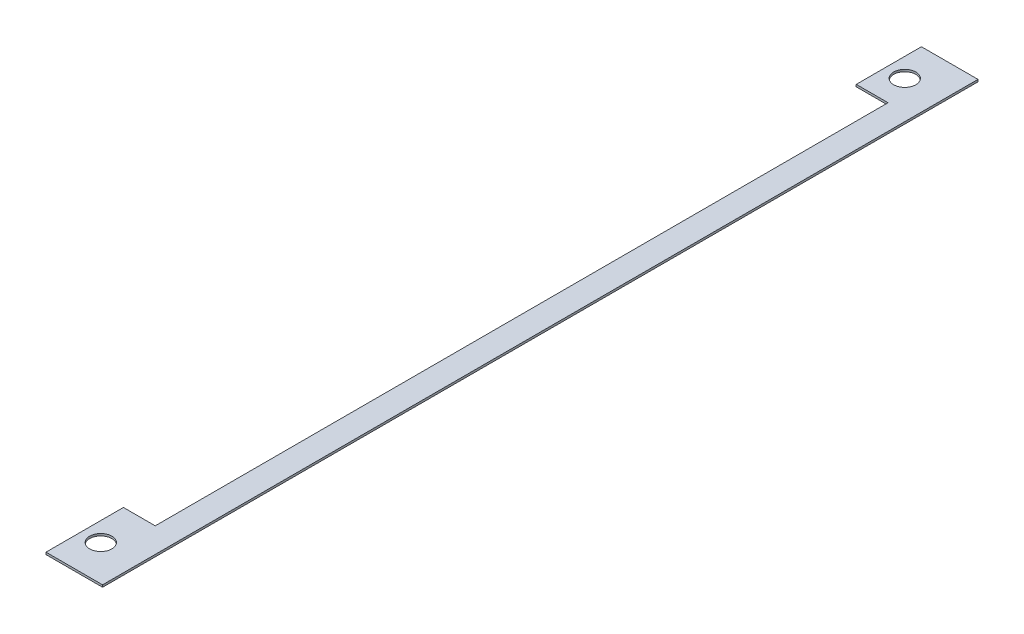
ISO-10303-21;
HEADER;
FILE_DESCRIPTION(('STEP AP214'),'2;1');
FILE_NAME('part.step','',(''),(''),'','','');
FILE_SCHEMA(('AUTOMOTIVE_DESIGN { 1 0 10303 214 1 1 1 1 }'));
ENDSEC;
DATA;
#1=APPLICATION_CONTEXT('core data for automotive mechanical design processes');
#2=APPLICATION_PROTOCOL_DEFINITION('international standard','automotive_design',2000,#1);
#3=PRODUCT_CONTEXT('',#1,'mechanical');
#4=PRODUCT('Part','Part','',(#3));
#5=PRODUCT_RELATED_PRODUCT_CATEGORY('part','',(#4));
#6=PRODUCT_DEFINITION_FORMATION('','',#4);
#7=PRODUCT_DEFINITION_CONTEXT('part definition',#1,'design');
#8=PRODUCT_DEFINITION('design','',#6,#7);
#9=PRODUCT_DEFINITION_SHAPE('','',#8);
#10=(LENGTH_UNIT() NAMED_UNIT(*) SI_UNIT(.MILLI.,.METRE.));
#11=(NAMED_UNIT(*) PLANE_ANGLE_UNIT() SI_UNIT($,.RADIAN.));
#12=(NAMED_UNIT(*) SI_UNIT($,.STERADIAN.) SOLID_ANGLE_UNIT());
#13=UNCERTAINTY_MEASURE_WITH_UNIT(LENGTH_MEASURE(1.E-05),#10,'distance_accuracy_value','');
#14=(GEOMETRIC_REPRESENTATION_CONTEXT(3) GLOBAL_UNCERTAINTY_ASSIGNED_CONTEXT((#13)) GLOBAL_UNIT_ASSIGNED_CONTEXT((#10,
#11,#12)) REPRESENTATION_CONTEXT('',''));
#15=CARTESIAN_POINT('',(0.,0.,0.));
#16=DIRECTION('',(0.,0.,1.));
#17=DIRECTION('',(1.,0.,0.));
#18=AXIS2_PLACEMENT_3D('',#15,#16,#17);
#19=CARTESIAN_POINT('',(0.,-15.4,-135.4));
#20=DIRECTION('',(0.,0.,1.));
#21=DIRECTION('',(1.,0.,0.));
#22=AXIS2_PLACEMENT_3D('',#19,#20,#21);
#23=PLANE('',#22);
#24=DIRECTION('',(1.,0.,0.));
#25=VECTOR('',#24,1.);
#26=CARTESIAN_POINT('',(0.,-15.4,-135.4));
#27=LINE('',#26,#25);
#28=CARTESIAN_POINT('',(194.168067580839,-15.4,-135.4));
#29=VERTEX_POINT('',#28);
#30=CARTESIAN_POINT('',(210.,-15.4,-135.4));
#31=VERTEX_POINT('',#30);
#32=EDGE_CURVE('E138',#29,#31,#27,.T.);
#33=ORIENTED_EDGE('',*,*,#32,.F.);
#34=DIRECTION('',(0.,1.,0.));
#35=VECTOR('',#34,1.);
#36=CARTESIAN_POINT('',(194.168067580839,-15.4,-135.4));
#37=LINE('',#36,#35);
#38=CARTESIAN_POINT('',(194.168067580839,-14.8,-135.4));
#39=VERTEX_POINT('',#38);
#40=EDGE_CURVE('E125',#29,#39,#37,.T.);
#41=ORIENTED_EDGE('',*,*,#40,.T.);
#42=DIRECTION('',(1.,0.,0.));
#43=VECTOR('',#42,1.);
#44=CARTESIAN_POINT('',(-36.,-14.8,-135.4));
#45=LINE('',#44,#43);
#46=CARTESIAN_POINT('',(210.,-14.8,-135.4));
#47=VERTEX_POINT('',#46);
#48=EDGE_CURVE('E153',#39,#47,#45,.T.);
#49=ORIENTED_EDGE('',*,*,#48,.T.);
#50=DIRECTION('',(0.,1.,0.));
#51=VECTOR('',#50,1.);
#52=CARTESIAN_POINT('',(210.,-15.4,-135.4));
#53=LINE('',#52,#51);
#54=EDGE_CURVE('E54',#31,#47,#53,.T.);
#55=ORIENTED_EDGE('',*,*,#54,.F.);
#56=EDGE_LOOP('',(#33,#41,#49,#55));
#57=FACE_BOUND('',#56,.T.);
#58=ADVANCED_FACE('F46',(#57),#23,.F.);
#59=CARTESIAN_POINT('',(210.,-15.4,0.));
#60=DIRECTION('',(1.,0.,0.));
#61=DIRECTION('',(0.,0.,-1.));
#62=AXIS2_PLACEMENT_3D('',#59,#60,#61);
#63=PLANE('',#62);
#64=DIRECTION('',(0.,0.,1.));
#65=VECTOR('',#64,1.);
#66=CARTESIAN_POINT('',(210.,-14.8,-135.4));
#67=LINE('',#66,#65);
#68=CARTESIAN_POINT('',(210.,-14.8,109.6));
#69=VERTEX_POINT('',#68);
#70=EDGE_CURVE('E148',#47,#69,#67,.T.);
#71=ORIENTED_EDGE('',*,*,#70,.T.);
#72=DIRECTION('',(0.,1.,0.));
#73=VECTOR('',#72,1.);
#74=CARTESIAN_POINT('',(210.,-15.4,109.6));
#75=LINE('',#74,#73);
#76=CARTESIAN_POINT('',(210.,-15.4,109.6));
#77=VERTEX_POINT('',#76);
#78=EDGE_CURVE('E133',#77,#69,#75,.T.);
#79=ORIENTED_EDGE('',*,*,#78,.F.);
#80=DIRECTION('',(0.,0.,-1.));
#81=VECTOR('',#80,1.);
#82=CARTESIAN_POINT('',(210.,-15.4,0.));
#83=LINE('',#82,#81);
#84=EDGE_CURVE('E131',#77,#31,#83,.T.);
#85=ORIENTED_EDGE('',*,*,#84,.T.);
#86=ORIENTED_EDGE('',*,*,#54,.T.);
#87=EDGE_LOOP('',(#71,#79,#85,#86));
#88=FACE_BOUND('',#87,.T.);
#89=ADVANCED_FACE('F146',(#88),#63,.T.);
#90=CARTESIAN_POINT('',(0.,-15.4,109.6));
#91=DIRECTION('',(0.,0.,1.));
#92=DIRECTION('',(1.,0.,0.));
#93=AXIS2_PLACEMENT_3D('',#90,#91,#92);
#94=PLANE('',#93);
#95=DIRECTION('',(0.,1.,0.));
#96=VECTOR('',#95,1.);
#97=CARTESIAN_POINT('',(194.168067580839,-15.4,109.6));
#98=LINE('',#97,#96);
#99=CARTESIAN_POINT('',(194.168067580839,-15.4,109.6));
#100=VERTEX_POINT('',#99);
#101=CARTESIAN_POINT('',(194.168067580839,-14.8,109.6));
#102=VERTEX_POINT('',#101);
#103=EDGE_CURVE('E111',#100,#102,#98,.T.);
#104=ORIENTED_EDGE('',*,*,#103,.F.);
#105=DIRECTION('',(1.,0.,0.));
#106=VECTOR('',#105,1.);
#107=CARTESIAN_POINT('',(0.,-15.4,109.6));
#108=LINE('',#107,#106);
#109=EDGE_CURVE('E121',#100,#77,#108,.T.);
#110=ORIENTED_EDGE('',*,*,#109,.T.);
#111=ORIENTED_EDGE('',*,*,#78,.T.);
#112=DIRECTION('',(1.,0.,0.));
#113=VECTOR('',#112,1.);
#114=CARTESIAN_POINT('',(-36.,-14.8,109.6));
#115=LINE('',#114,#113);
#116=EDGE_CURVE('E123',#102,#69,#115,.T.);
#117=ORIENTED_EDGE('',*,*,#116,.F.);
#118=EDGE_LOOP('',(#104,#110,#111,#117));
#119=FACE_BOUND('',#118,.T.);
#120=ADVANCED_FACE('F119',(#119),#94,.T.);
#121=CARTESIAN_POINT('',(0.,-15.4,0.));
#122=DIRECTION('',(0.,-1.,0.));
#123=DIRECTION('',(0.,0.,-1.));
#124=AXIS2_PLACEMENT_3D('',#121,#122,#123);
#125=PLANE('',#124);
#126=DIRECTION('',(0.,0.,-1.));
#127=VECTOR('',#126,1.);
#128=CARTESIAN_POINT('',(194.168067580839,-15.4,-135.4));
#129=LINE('',#128,#127);
#130=CARTESIAN_POINT('',(194.168067580839,-15.4,-117.157752646535));
#131=VERTEX_POINT('',#130);
#132=EDGE_CURVE('E61',#131,#29,#129,.T.);
#133=ORIENTED_EDGE('',*,*,#132,.T.);
#134=ORIENTED_EDGE('',*,*,#32,.T.);
#135=ORIENTED_EDGE('',*,*,#84,.F.);
#136=ORIENTED_EDGE('',*,*,#109,.F.);
#137=CARTESIAN_POINT('',(194.168067580839,-15.4,87.9338527238244));
#138=VERTEX_POINT('',#137);
#139=EDGE_CURVE('E108',#100,#138,#129,.T.);
#140=ORIENTED_EDGE('',*,*,#139,.T.);
#141=DIRECTION('',(1.,0.,0.));
#142=VECTOR('',#141,1.);
#143=CARTESIAN_POINT('',(203.070207379886,-15.4,87.9338527238244));
#144=LINE('',#143,#142);
#145=CARTESIAN_POINT('',(203.070207379886,-15.4,87.9338527238244));
#146=VERTEX_POINT('',#145);
#147=EDGE_CURVE('E195',#138,#146,#144,.T.);
#148=ORIENTED_EDGE('',*,*,#147,.T.);
#149=DIRECTION('',(0.,0.,-1.));
#150=VECTOR('',#149,1.);
#151=CARTESIAN_POINT('',(203.070207379886,-15.4,-117.157752646535));
#152=LINE('',#151,#150);
#153=CARTESIAN_POINT('',(203.070207379886,-15.4,-117.157752646535));
#154=VERTEX_POINT('',#153);
#155=EDGE_CURVE('E198',#146,#154,#152,.T.);
#156=ORIENTED_EDGE('',*,*,#155,.T.);
#157=DIRECTION('',(-1.,0.,0.));
#158=VECTOR('',#157,1.);
#159=CARTESIAN_POINT('',(187.662657727689,-15.4,-117.157752646535));
#160=LINE('',#159,#158);
#161=EDGE_CURVE('E183',#154,#131,#160,.T.);
#162=ORIENTED_EDGE('',*,*,#161,.T.);
#163=EDGE_LOOP('',(#133,#134,#135,#136,#140,#148,#156,#162));
#164=FACE_BOUND('',#163,.T.);
#165=CARTESIAN_POINT('',(199.5,-15.4,99.6000000000001));
#166=DIRECTION('',(0.,1.,0.));
#167=DIRECTION('',(0.,0.,1.));
#168=AXIS2_PLACEMENT_3D('',#165,#166,#167);
#169=CIRCLE('',#168,3.09999999999999);
#170=CARTESIAN_POINT('',(199.5,-15.4,102.7));
#171=VERTEX_POINT('',#170);
#172=EDGE_CURVE('E172',#171,#171,#169,.T.);
#173=ORIENTED_EDGE('',*,*,#172,.T.);
#174=EDGE_LOOP('',(#173));
#175=FACE_BOUND('',#174,.T.);
#176=CARTESIAN_POINT('',(199.5,-15.4,-125.4));
#177=DIRECTION('',(0.,1.,0.));
#178=DIRECTION('',(0.,0.,1.));
#179=AXIS2_PLACEMENT_3D('',#176,#177,#178);
#180=CIRCLE('',#179,3.09999999999999);
#181=CARTESIAN_POINT('',(199.5,-15.4,-122.3));
#182=VERTEX_POINT('',#181);
#183=EDGE_CURVE('E173',#182,#182,#180,.T.);
#184=ORIENTED_EDGE('',*,*,#183,.T.);
#185=EDGE_LOOP('',(#184));
#186=FACE_BOUND('',#185,.T.);
#187=ADVANCED_FACE('F128',(#164,#175,#186),#125,.T.);
#188=CARTESIAN_POINT('',(199.5,-15.4,-125.4));
#189=DIRECTION('',(0.,1.,0.));
#190=DIRECTION('',(0.,0.,1.));
#191=AXIS2_PLACEMENT_3D('',#188,#189,#190);
#192=CYLINDRICAL_SURFACE('',#191,3.09999999999999);
#193=CARTESIAN_POINT('',(199.5,-14.8,-125.4));
#194=DIRECTION('',(0.,-1.,0.));
#195=DIRECTION('',(0.,0.,-1.));
#196=AXIS2_PLACEMENT_3D('',#193,#194,#195);
#197=CIRCLE('',#196,3.09999999999999);
#198=CARTESIAN_POINT('',(199.5,-14.8,-128.5));
#199=VERTEX_POINT('',#198);
#200=EDGE_CURVE('E165',#199,#199,#197,.F.);
#201=ORIENTED_EDGE('',*,*,#200,.T.);
#202=EDGE_LOOP('',(#201));
#203=FACE_BOUND('',#202,.T.);
#204=ORIENTED_EDGE('',*,*,#183,.F.);
#205=EDGE_LOOP('',(#204));
#206=FACE_BOUND('',#205,.T.);
#207=ADVANCED_FACE('F253',(#203,#206),#192,.F.);
#208=CARTESIAN_POINT('',(199.5,-15.4,99.6000000000001));
#209=DIRECTION('',(0.,1.,0.));
#210=DIRECTION('',(0.,0.,1.));
#211=AXIS2_PLACEMENT_3D('',#208,#209,#210);
#212=CYLINDRICAL_SURFACE('',#211,3.09999999999999);
#213=CARTESIAN_POINT('',(199.5,-14.8,99.6000000000001));
#214=DIRECTION('',(0.,-1.,0.));
#215=DIRECTION('',(0.,0.,-1.));
#216=AXIS2_PLACEMENT_3D('',#213,#214,#215);
#217=CIRCLE('',#216,3.09999999999999);
#218=CARTESIAN_POINT('',(199.5,-14.8,96.5000000000001));
#219=VERTEX_POINT('',#218);
#220=EDGE_CURVE('E161',#219,#219,#217,.F.);
#221=ORIENTED_EDGE('',*,*,#220,.T.);
#222=EDGE_LOOP('',(#221));
#223=FACE_BOUND('',#222,.T.);
#224=ORIENTED_EDGE('',*,*,#172,.F.);
#225=EDGE_LOOP('',(#224));
#226=FACE_BOUND('',#225,.T.);
#227=ADVANCED_FACE('F254',(#223,#226),#212,.F.);
#228=CARTESIAN_POINT('',(-36.,-14.8,-135.4));
#229=DIRECTION('',(0.,-1.,0.));
#230=DIRECTION('',(0.,0.,-1.));
#231=AXIS2_PLACEMENT_3D('',#228,#229,#230);
#232=PLANE('',#231);
#233=ORIENTED_EDGE('',*,*,#48,.F.);
#234=DIRECTION('',(0.,0.,-1.));
#235=VECTOR('',#234,1.);
#236=CARTESIAN_POINT('',(194.168067580839,-14.8,-135.4));
#237=LINE('',#236,#235);
#238=CARTESIAN_POINT('',(194.168067580839,-14.8,-117.157752646535));
#239=VERTEX_POINT('',#238);
#240=EDGE_CURVE('E186',#239,#39,#237,.T.);
#241=ORIENTED_EDGE('',*,*,#240,.F.);
#242=DIRECTION('',(-1.,0.,0.));
#243=VECTOR('',#242,1.);
#244=CARTESIAN_POINT('',(187.662657727689,-14.8,-117.157752646535));
#245=LINE('',#244,#243);
#246=CARTESIAN_POINT('',(203.070207379886,-14.8,-117.157752646535));
#247=VERTEX_POINT('',#246);
#248=EDGE_CURVE('E199',#247,#239,#245,.T.);
#249=ORIENTED_EDGE('',*,*,#248,.F.);
#250=DIRECTION('',(0.,0.,-1.));
#251=VECTOR('',#250,1.);
#252=CARTESIAN_POINT('',(203.070207379886,-14.8,-117.157752646535));
#253=LINE('',#252,#251);
#254=CARTESIAN_POINT('',(203.070207379886,-14.8,87.9338527238244));
#255=VERTEX_POINT('',#254);
#256=EDGE_CURVE('E207',#255,#247,#253,.T.);
#257=ORIENTED_EDGE('',*,*,#256,.F.);
#258=DIRECTION('',(1.,0.,0.));
#259=VECTOR('',#258,1.);
#260=CARTESIAN_POINT('',(203.070207379886,-14.8,87.9338527238244));
#261=LINE('',#260,#259);
#262=CARTESIAN_POINT('',(194.168067580839,-14.8,87.9338527238244));
#263=VERTEX_POINT('',#262);
#264=EDGE_CURVE('E194',#263,#255,#261,.T.);
#265=ORIENTED_EDGE('',*,*,#264,.F.);
#266=EDGE_CURVE('E69',#102,#263,#237,.T.);
#267=ORIENTED_EDGE('',*,*,#266,.F.);
#268=ORIENTED_EDGE('',*,*,#116,.T.);
#269=ORIENTED_EDGE('',*,*,#70,.F.);
#270=EDGE_LOOP('',(#233,#241,#249,#257,#265,#267,#268,#269));
#271=FACE_BOUND('',#270,.T.);
#272=ORIENTED_EDGE('',*,*,#200,.F.);
#273=EDGE_LOOP('',(#272));
#274=FACE_BOUND('',#273,.T.);
#275=ORIENTED_EDGE('',*,*,#220,.F.);
#276=EDGE_LOOP('',(#275));
#277=FACE_BOUND('',#276,.T.);
#278=ADVANCED_FACE('F158',(#271,#274,#277),#232,.F.);
#279=CARTESIAN_POINT('',(187.662657727689,-15.4,-117.157752646535));
#280=DIRECTION('',(0.,0.,-1.));
#281=DIRECTION('',(-1.,0.,0.));
#282=AXIS2_PLACEMENT_3D('',#279,#280,#281);
#283=PLANE('',#282);
#284=ORIENTED_EDGE('',*,*,#248,.T.);
#285=DIRECTION('',(0.,-1.,0.));
#286=VECTOR('',#285,1.);
#287=CARTESIAN_POINT('',(194.168067580839,-15.4,-117.157752646535));
#288=LINE('',#287,#286);
#289=EDGE_CURVE('E190',#239,#131,#288,.T.);
#290=ORIENTED_EDGE('',*,*,#289,.T.);
#291=ORIENTED_EDGE('',*,*,#161,.F.);
#292=DIRECTION('',(0.,1.,0.));
#293=VECTOR('',#292,1.);
#294=CARTESIAN_POINT('',(203.070207379886,-15.4,-117.157752646535));
#295=LINE('',#294,#293);
#296=EDGE_CURVE('E214',#154,#247,#295,.T.);
#297=ORIENTED_EDGE('',*,*,#296,.T.);
#298=EDGE_LOOP('',(#284,#290,#291,#297));
#299=FACE_BOUND('',#298,.T.);
#300=ADVANCED_FACE('F228',(#299),#283,.F.);
#301=CARTESIAN_POINT('',(203.070207379886,-15.4,-117.157752646535));
#302=DIRECTION('',(1.,0.,0.));
#303=DIRECTION('',(0.,0.,-1.));
#304=AXIS2_PLACEMENT_3D('',#301,#302,#303);
#305=PLANE('',#304);
#306=ORIENTED_EDGE('',*,*,#256,.T.);
#307=ORIENTED_EDGE('',*,*,#296,.F.);
#308=ORIENTED_EDGE('',*,*,#155,.F.);
#309=DIRECTION('',(0.,1.,0.));
#310=VECTOR('',#309,1.);
#311=CARTESIAN_POINT('',(203.070207379886,-15.4,87.9338527238244));
#312=LINE('',#311,#310);
#313=EDGE_CURVE('E204',#146,#255,#312,.T.);
#314=ORIENTED_EDGE('',*,*,#313,.T.);
#315=EDGE_LOOP('',(#306,#307,#308,#314));
#316=FACE_BOUND('',#315,.T.);
#317=ADVANCED_FACE('F223',(#316),#305,.F.);
#318=CARTESIAN_POINT('',(203.070207379886,-15.4,87.9338527238244));
#319=DIRECTION('',(0.,0.,1.));
#320=DIRECTION('',(1.,0.,0.));
#321=AXIS2_PLACEMENT_3D('',#318,#319,#320);
#322=PLANE('',#321);
#323=ORIENTED_EDGE('',*,*,#147,.F.);
#324=DIRECTION('',(0.,1.,0.));
#325=VECTOR('',#324,1.);
#326=CARTESIAN_POINT('',(194.168067580839,-15.4,87.9338527238244));
#327=LINE('',#326,#325);
#328=EDGE_CURVE('E11',#138,#263,#327,.T.);
#329=ORIENTED_EDGE('',*,*,#328,.T.);
#330=ORIENTED_EDGE('',*,*,#264,.T.);
#331=ORIENTED_EDGE('',*,*,#313,.F.);
#332=EDGE_LOOP('',(#323,#329,#330,#331));
#333=FACE_BOUND('',#332,.T.);
#334=ADVANCED_FACE('F229',(#333),#322,.F.);
#335=CARTESIAN_POINT('',(194.168067580839,-15.4,-135.4));
#336=DIRECTION('',(1.,0.,0.));
#337=DIRECTION('',(0.,0.,-1.));
#338=AXIS2_PLACEMENT_3D('',#335,#336,#337);
#339=PLANE('',#338);
#340=ORIENTED_EDGE('',*,*,#139,.F.);
#341=ORIENTED_EDGE('',*,*,#103,.T.);
#342=ORIENTED_EDGE('',*,*,#266,.T.);
#343=ORIENTED_EDGE('',*,*,#328,.F.);
#344=EDGE_LOOP('',(#340,#341,#342,#343));
#345=FACE_BOUND('',#344,.T.);
#346=ADVANCED_FACE('F110',(#345),#339,.F.);
#347=ORIENTED_EDGE('',*,*,#240,.T.);
#348=ORIENTED_EDGE('',*,*,#40,.F.);
#349=ORIENTED_EDGE('',*,*,#132,.F.);
#350=ORIENTED_EDGE('',*,*,#289,.F.);
#351=EDGE_LOOP('',(#347,#348,#349,#350));
#352=FACE_BOUND('',#351,.T.);
#353=ADVANCED_FACE('F236',(#352),#339,.F.);
#354=CLOSED_SHELL('',(#58,#89,#120,#187,#207,#227,#278,#300,#317,#334,#346,#353));
#355=MANIFOLD_SOLID_BREP('B2',#354);
#356=ADVANCED_BREP_SHAPE_REPRESENTATION('',(#18,#355),#14);
#357=SHAPE_DEFINITION_REPRESENTATION(#9,#356);
ENDSEC;
END-ISO-10303-21;
